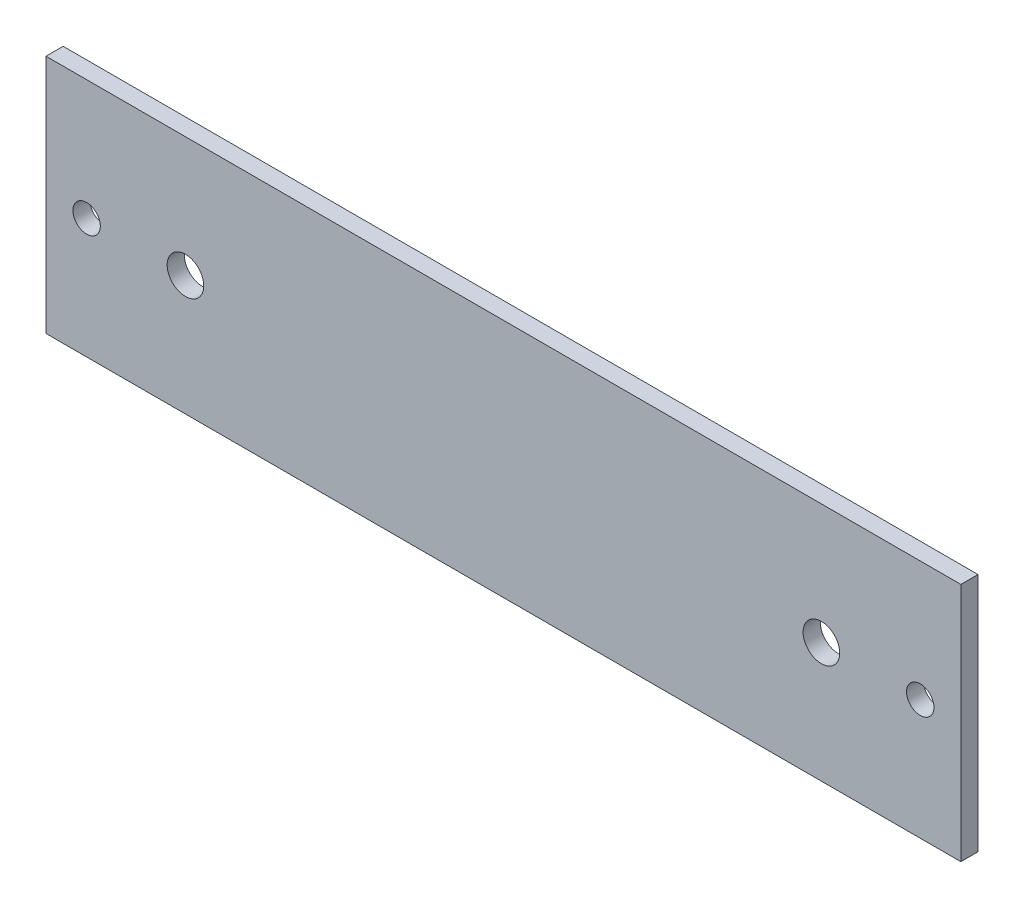
ISO-10303-21;
HEADER;
FILE_DESCRIPTION(('STEP AP214'),'2;1');
FILE_NAME('part.step','',(''),(''),'','','');
FILE_SCHEMA(('AUTOMOTIVE_DESIGN { 1 0 10303 214 1 1 1 1 }'));
ENDSEC;
DATA;
#1=APPLICATION_CONTEXT('core data for automotive mechanical design processes');
#2=APPLICATION_PROTOCOL_DEFINITION('international standard','automotive_design',2000,#1);
#3=PRODUCT_CONTEXT('',#1,'mechanical');
#4=PRODUCT('Part','Part','',(#3));
#5=PRODUCT_RELATED_PRODUCT_CATEGORY('part','',(#4));
#6=PRODUCT_DEFINITION_FORMATION('','',#4);
#7=PRODUCT_DEFINITION_CONTEXT('part definition',#1,'design');
#8=PRODUCT_DEFINITION('design','',#6,#7);
#9=PRODUCT_DEFINITION_SHAPE('','',#8);
#10=(LENGTH_UNIT() NAMED_UNIT(*) SI_UNIT(.MILLI.,.METRE.));
#11=(NAMED_UNIT(*) PLANE_ANGLE_UNIT() SI_UNIT($,.RADIAN.));
#12=(NAMED_UNIT(*) SI_UNIT($,.STERADIAN.) SOLID_ANGLE_UNIT());
#13=UNCERTAINTY_MEASURE_WITH_UNIT(LENGTH_MEASURE(1.E-05),#10,'distance_accuracy_value','');
#14=(GEOMETRIC_REPRESENTATION_CONTEXT(3) GLOBAL_UNCERTAINTY_ASSIGNED_CONTEXT((#13)) GLOBAL_UNIT_ASSIGNED_CONTEXT((#10,
#11,#12)) REPRESENTATION_CONTEXT('',''));
#15=CARTESIAN_POINT('',(0.,0.,0.));
#16=DIRECTION('',(0.,0.,1.));
#17=DIRECTION('',(1.,0.,0.));
#18=AXIS2_PLACEMENT_3D('',#15,#16,#17);
#19=CARTESIAN_POINT('',(0.,0.,1.5));
#20=DIRECTION('',(0.,0.,1.));
#21=DIRECTION('',(1.,0.,0.));
#22=AXIS2_PLACEMENT_3D('',#19,#20,#21);
#23=PLANE('',#22);
#24=CARTESIAN_POINT('',(27.805,0.,1.5));
#25=DIRECTION('',(0.,0.,1.));
#26=DIRECTION('',(-1.,0.,0.));
#27=AXIS2_PLACEMENT_3D('',#24,#25,#26);
#28=CIRCLE('',#27,1.6);
#29=CARTESIAN_POINT('',(26.205,0.,1.5));
#30=VERTEX_POINT('',#29);
#31=EDGE_CURVE('E125',#30,#30,#28,.T.);
#32=ORIENTED_EDGE('',*,*,#31,.F.);
#33=EDGE_LOOP('',(#32));
#34=FACE_BOUND('',#33,.T.);
#35=CARTESIAN_POINT('',(-36.45,0.,1.5));
#36=DIRECTION('',(0.,0.,1.));
#37=DIRECTION('',(1.,0.,0.));
#38=AXIS2_PLACEMENT_3D('',#35,#36,#37);
#39=CIRCLE('',#38,1.2);
#40=CARTESIAN_POINT('',(-35.25,0.,1.5));
#41=VERTEX_POINT('',#40);
#42=EDGE_CURVE('E104',#41,#41,#39,.T.);
#43=ORIENTED_EDGE('',*,*,#42,.F.);
#44=EDGE_LOOP('',(#43));
#45=FACE_BOUND('',#44,.T.);
#46=DIRECTION('',(0.,1.,0.));
#47=VECTOR('',#46,1.);
#48=CARTESIAN_POINT('',(40.,10.5,1.5));
#49=LINE('',#48,#47);
#50=CARTESIAN_POINT('',(40.,-10.5,1.5));
#51=VERTEX_POINT('',#50);
#52=CARTESIAN_POINT('',(40.,10.5,1.5));
#53=VERTEX_POINT('',#52);
#54=EDGE_CURVE('E89',#51,#53,#49,.T.);
#55=ORIENTED_EDGE('',*,*,#54,.T.);
#56=DIRECTION('',(-1.,0.,0.));
#57=VECTOR('',#56,1.);
#58=CARTESIAN_POINT('',(-40.,10.5,1.5));
#59=LINE('',#58,#57);
#60=CARTESIAN_POINT('',(-40.,10.5,1.5));
#61=VERTEX_POINT('',#60);
#62=EDGE_CURVE('E84',#53,#61,#59,.T.);
#63=ORIENTED_EDGE('',*,*,#62,.T.);
#64=DIRECTION('',(0.,-1.,0.));
#65=VECTOR('',#64,1.);
#66=CARTESIAN_POINT('',(-40.,10.5,1.5));
#67=LINE('',#66,#65);
#68=CARTESIAN_POINT('',(-40.,-10.5,1.5));
#69=VERTEX_POINT('',#68);
#70=EDGE_CURVE('E87',#61,#69,#67,.T.);
#71=ORIENTED_EDGE('',*,*,#70,.T.);
#72=DIRECTION('',(1.,0.,0.));
#73=VECTOR('',#72,1.);
#74=CARTESIAN_POINT('',(-40.,-10.5,1.5));
#75=LINE('',#74,#73);
#76=EDGE_CURVE('E54',#69,#51,#75,.T.);
#77=ORIENTED_EDGE('',*,*,#76,.T.);
#78=EDGE_LOOP('',(#55,#63,#71,#77));
#79=FACE_BOUND('',#78,.T.);
#80=CARTESIAN_POINT('',(-27.805,0.,1.5));
#81=DIRECTION('',(0.,0.,1.));
#82=DIRECTION('',(1.,0.,0.));
#83=AXIS2_PLACEMENT_3D('',#80,#81,#82);
#84=CIRCLE('',#83,1.6);
#85=CARTESIAN_POINT('',(-26.205,0.,1.5));
#86=VERTEX_POINT('',#85);
#87=EDGE_CURVE('E119',#86,#86,#84,.T.);
#88=ORIENTED_EDGE('',*,*,#87,.F.);
#89=EDGE_LOOP('',(#88));
#90=FACE_BOUND('',#89,.T.);
#91=CARTESIAN_POINT('',(36.45,0.,1.5));
#92=DIRECTION('',(0.,0.,1.));
#93=DIRECTION('',(-1.,0.,0.));
#94=AXIS2_PLACEMENT_3D('',#91,#92,#93);
#95=CIRCLE('',#94,1.2);
#96=CARTESIAN_POINT('',(35.25,0.,1.5));
#97=VERTEX_POINT('',#96);
#98=EDGE_CURVE('E131',#97,#97,#95,.T.);
#99=ORIENTED_EDGE('',*,*,#98,.F.);
#100=EDGE_LOOP('',(#99));
#101=FACE_BOUND('',#100,.T.);
#102=ADVANCED_FACE('F37',(#34,#45,#79,#90,#101),#23,.T.);
#103=CARTESIAN_POINT('',(0.,0.,0.));
#104=DIRECTION('',(0.,0.,1.));
#105=DIRECTION('',(1.,0.,0.));
#106=AXIS2_PLACEMENT_3D('',#103,#104,#105);
#107=PLANE('',#106);
#108=CARTESIAN_POINT('',(27.805,0.,0.));
#109=DIRECTION('',(0.,0.,1.));
#110=DIRECTION('',(-1.,0.,0.));
#111=AXIS2_PLACEMENT_3D('',#108,#109,#110);
#112=CIRCLE('',#111,1.6);
#113=CARTESIAN_POINT('',(26.205,0.,0.));
#114=VERTEX_POINT('',#113);
#115=EDGE_CURVE('E128',#114,#114,#112,.T.);
#116=ORIENTED_EDGE('',*,*,#115,.T.);
#117=EDGE_LOOP('',(#116));
#118=FACE_BOUND('',#117,.T.);
#119=CARTESIAN_POINT('',(-36.45,0.,0.));
#120=DIRECTION('',(0.,0.,1.));
#121=DIRECTION('',(1.,0.,0.));
#122=AXIS2_PLACEMENT_3D('',#119,#120,#121);
#123=CIRCLE('',#122,1.2);
#124=CARTESIAN_POINT('',(-35.25,0.,0.));
#125=VERTEX_POINT('',#124);
#126=EDGE_CURVE('E116',#125,#125,#123,.T.);
#127=ORIENTED_EDGE('',*,*,#126,.T.);
#128=EDGE_LOOP('',(#127));
#129=FACE_BOUND('',#128,.T.);
#130=DIRECTION('',(0.,1.,0.));
#131=VECTOR('',#130,1.);
#132=CARTESIAN_POINT('',(40.,10.5,0.));
#133=LINE('',#132,#131);
#134=CARTESIAN_POINT('',(40.,-10.5,0.));
#135=VERTEX_POINT('',#134);
#136=CARTESIAN_POINT('',(40.,10.5,0.));
#137=VERTEX_POINT('',#136);
#138=EDGE_CURVE('E101',#135,#137,#133,.T.);
#139=ORIENTED_EDGE('',*,*,#138,.F.);
#140=DIRECTION('',(1.,0.,0.));
#141=VECTOR('',#140,1.);
#142=CARTESIAN_POINT('',(-40.,-10.5,0.));
#143=LINE('',#142,#141);
#144=CARTESIAN_POINT('',(-40.,-10.5,0.));
#145=VERTEX_POINT('',#144);
#146=EDGE_CURVE('E77',#145,#135,#143,.T.);
#147=ORIENTED_EDGE('',*,*,#146,.F.);
#148=DIRECTION('',(0.,-1.,0.));
#149=VECTOR('',#148,1.);
#150=CARTESIAN_POINT('',(-40.,10.5,0.));
#151=LINE('',#150,#149);
#152=CARTESIAN_POINT('',(-40.,10.5,0.));
#153=VERTEX_POINT('',#152);
#154=EDGE_CURVE('E71',#153,#145,#151,.T.);
#155=ORIENTED_EDGE('',*,*,#154,.F.);
#156=DIRECTION('',(-1.,0.,0.));
#157=VECTOR('',#156,1.);
#158=CARTESIAN_POINT('',(-40.,10.5,0.));
#159=LINE('',#158,#157);
#160=EDGE_CURVE('E93',#137,#153,#159,.T.);
#161=ORIENTED_EDGE('',*,*,#160,.F.);
#162=EDGE_LOOP('',(#139,#147,#155,#161));
#163=FACE_BOUND('',#162,.T.);
#164=CARTESIAN_POINT('',(-27.805,0.,0.));
#165=DIRECTION('',(0.,0.,1.));
#166=DIRECTION('',(1.,0.,0.));
#167=AXIS2_PLACEMENT_3D('',#164,#165,#166);
#168=CIRCLE('',#167,1.6);
#169=CARTESIAN_POINT('',(-26.205,0.,0.));
#170=VERTEX_POINT('',#169);
#171=EDGE_CURVE('E122',#170,#170,#168,.T.);
#172=ORIENTED_EDGE('',*,*,#171,.T.);
#173=EDGE_LOOP('',(#172));
#174=FACE_BOUND('',#173,.T.);
#175=CARTESIAN_POINT('',(36.45,0.,0.));
#176=DIRECTION('',(0.,0.,1.));
#177=DIRECTION('',(-1.,0.,0.));
#178=AXIS2_PLACEMENT_3D('',#175,#176,#177);
#179=CIRCLE('',#178,1.2);
#180=CARTESIAN_POINT('',(35.25,0.,0.));
#181=VERTEX_POINT('',#180);
#182=EDGE_CURVE('E134',#181,#181,#179,.T.);
#183=ORIENTED_EDGE('',*,*,#182,.T.);
#184=EDGE_LOOP('',(#183));
#185=FACE_BOUND('',#184,.T.);
#186=ADVANCED_FACE('F112',(#118,#129,#163,#174,#185),#107,.F.);
#187=CARTESIAN_POINT('',(40.,10.5,1.5));
#188=DIRECTION('',(-1.,0.,0.));
#189=DIRECTION('',(0.,0.,1.));
#190=AXIS2_PLACEMENT_3D('',#187,#188,#189);
#191=PLANE('',#190);
#192=ORIENTED_EDGE('',*,*,#138,.T.);
#193=DIRECTION('',(0.,0.,-1.));
#194=VECTOR('',#193,1.);
#195=CARTESIAN_POINT('',(40.,10.5,1.5));
#196=LINE('',#195,#194);
#197=EDGE_CURVE('E11',#53,#137,#196,.T.);
#198=ORIENTED_EDGE('',*,*,#197,.F.);
#199=ORIENTED_EDGE('',*,*,#54,.F.);
#200=DIRECTION('',(0.,0.,-1.));
#201=VECTOR('',#200,1.);
#202=CARTESIAN_POINT('',(40.,-10.5,1.5));
#203=LINE('',#202,#201);
#204=EDGE_CURVE('E97',#51,#135,#203,.T.);
#205=ORIENTED_EDGE('',*,*,#204,.T.);
#206=EDGE_LOOP('',(#192,#198,#199,#205));
#207=FACE_BOUND('',#206,.T.);
#208=ADVANCED_FACE('F39',(#207),#191,.F.);
#209=CARTESIAN_POINT('',(-40.,10.5,1.5));
#210=DIRECTION('',(0.,-1.,0.));
#211=DIRECTION('',(0.,0.,-1.));
#212=AXIS2_PLACEMENT_3D('',#209,#210,#211);
#213=PLANE('',#212);
#214=ORIENTED_EDGE('',*,*,#160,.T.);
#215=DIRECTION('',(0.,0.,-1.));
#216=VECTOR('',#215,1.);
#217=CARTESIAN_POINT('',(-40.,10.5,1.5));
#218=LINE('',#217,#216);
#219=EDGE_CURVE('E46',#61,#153,#218,.T.);
#220=ORIENTED_EDGE('',*,*,#219,.F.);
#221=ORIENTED_EDGE('',*,*,#62,.F.);
#222=ORIENTED_EDGE('',*,*,#197,.T.);
#223=EDGE_LOOP('',(#214,#220,#221,#222));
#224=FACE_BOUND('',#223,.T.);
#225=ADVANCED_FACE('F92',(#224),#213,.F.);
#226=CARTESIAN_POINT('',(-40.,10.5,1.5));
#227=DIRECTION('',(1.,0.,0.));
#228=DIRECTION('',(0.,0.,-1.));
#229=AXIS2_PLACEMENT_3D('',#226,#227,#228);
#230=PLANE('',#229);
#231=ORIENTED_EDGE('',*,*,#154,.T.);
#232=DIRECTION('',(0.,0.,-1.));
#233=VECTOR('',#232,1.);
#234=CARTESIAN_POINT('',(-40.,-10.5,1.5));
#235=LINE('',#234,#233);
#236=EDGE_CURVE('E94',#69,#145,#235,.T.);
#237=ORIENTED_EDGE('',*,*,#236,.F.);
#238=ORIENTED_EDGE('',*,*,#70,.F.);
#239=ORIENTED_EDGE('',*,*,#219,.T.);
#240=EDGE_LOOP('',(#231,#237,#238,#239));
#241=FACE_BOUND('',#240,.T.);
#242=ADVANCED_FACE('F95',(#241),#230,.F.);
#243=CARTESIAN_POINT('',(-40.,-10.5,1.5));
#244=DIRECTION('',(0.,1.,0.));
#245=DIRECTION('',(-1.,0.,0.));
#246=AXIS2_PLACEMENT_3D('',#243,#244,#245);
#247=PLANE('',#246);
#248=ORIENTED_EDGE('',*,*,#146,.T.);
#249=ORIENTED_EDGE('',*,*,#204,.F.);
#250=ORIENTED_EDGE('',*,*,#76,.F.);
#251=ORIENTED_EDGE('',*,*,#236,.T.);
#252=EDGE_LOOP('',(#248,#249,#250,#251));
#253=FACE_BOUND('',#252,.T.);
#254=ADVANCED_FACE('F109',(#253),#247,.F.);
#255=CARTESIAN_POINT('',(-36.45,0.,1.5));
#256=DIRECTION('',(0.,0.,-1.));
#257=DIRECTION('',(-1.,0.,0.));
#258=AXIS2_PLACEMENT_3D('',#255,#256,#257);
#259=CYLINDRICAL_SURFACE('',#258,1.2);
#260=ORIENTED_EDGE('',*,*,#42,.T.);
#261=EDGE_LOOP('',(#260));
#262=FACE_BOUND('',#261,.T.);
#263=ORIENTED_EDGE('',*,*,#126,.F.);
#264=EDGE_LOOP('',(#263));
#265=FACE_BOUND('',#264,.T.);
#266=ADVANCED_FACE('F154',(#262,#265),#259,.F.);
#267=CARTESIAN_POINT('',(-27.805,0.,1.5));
#268=DIRECTION('',(0.,0.,-1.));
#269=DIRECTION('',(-1.,0.,0.));
#270=AXIS2_PLACEMENT_3D('',#267,#268,#269);
#271=CYLINDRICAL_SURFACE('',#270,1.6);
#272=ORIENTED_EDGE('',*,*,#87,.T.);
#273=EDGE_LOOP('',(#272));
#274=FACE_BOUND('',#273,.T.);
#275=ORIENTED_EDGE('',*,*,#171,.F.);
#276=EDGE_LOOP('',(#275));
#277=FACE_BOUND('',#276,.T.);
#278=ADVANCED_FACE('F200',(#274,#277),#271,.F.);
#279=CARTESIAN_POINT('',(27.805,0.,1.5));
#280=DIRECTION('',(0.,0.,-1.));
#281=DIRECTION('',(-1.,0.,0.));
#282=AXIS2_PLACEMENT_3D('',#279,#280,#281);
#283=CYLINDRICAL_SURFACE('',#282,1.6);
#284=ORIENTED_EDGE('',*,*,#31,.T.);
#285=EDGE_LOOP('',(#284));
#286=FACE_BOUND('',#285,.T.);
#287=ORIENTED_EDGE('',*,*,#115,.F.);
#288=EDGE_LOOP('',(#287));
#289=FACE_BOUND('',#288,.T.);
#290=ADVANCED_FACE('F208',(#286,#289),#283,.F.);
#291=CARTESIAN_POINT('',(36.45,0.,1.5));
#292=DIRECTION('',(0.,0.,-1.));
#293=DIRECTION('',(-1.,0.,0.));
#294=AXIS2_PLACEMENT_3D('',#291,#292,#293);
#295=CYLINDRICAL_SURFACE('',#294,1.2);
#296=ORIENTED_EDGE('',*,*,#98,.T.);
#297=EDGE_LOOP('',(#296));
#298=FACE_BOUND('',#297,.T.);
#299=ORIENTED_EDGE('',*,*,#182,.F.);
#300=EDGE_LOOP('',(#299));
#301=FACE_BOUND('',#300,.T.);
#302=ADVANCED_FACE('F140',(#298,#301),#295,.F.);
#303=CLOSED_SHELL('',(#102,#186,#208,#225,#242,#254,#266,#278,#290,#302));
#304=MANIFOLD_SOLID_BREP('B2',#303);
#305=ADVANCED_BREP_SHAPE_REPRESENTATION('',(#18,#304),#14);
#306=SHAPE_DEFINITION_REPRESENTATION(#9,#305);
ENDSEC;
END-ISO-10303-21;
